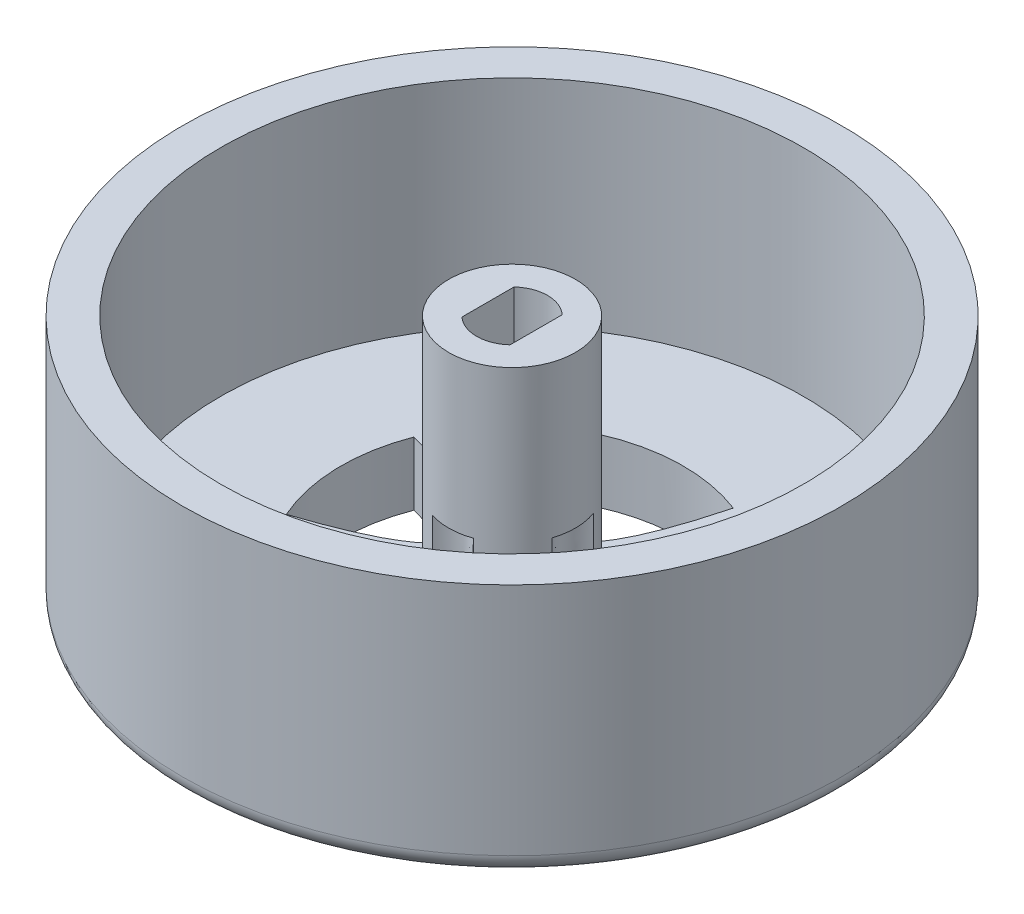
ISO-10303-21;
HEADER;
FILE_DESCRIPTION(('STEP AP214'),'2;1');
FILE_NAME('part.step','',(''),(''),'','','');
FILE_SCHEMA(('AUTOMOTIVE_DESIGN { 1 0 10303 214 1 1 1 1 }'));
ENDSEC;
DATA;
#1=APPLICATION_CONTEXT('core data for automotive mechanical design processes');
#2=APPLICATION_PROTOCOL_DEFINITION('international standard','automotive_design',2000,#1);
#3=PRODUCT_CONTEXT('',#1,'mechanical');
#4=PRODUCT('Part','Part','',(#3));
#5=PRODUCT_RELATED_PRODUCT_CATEGORY('part','',(#4));
#6=PRODUCT_DEFINITION_FORMATION('','',#4);
#7=PRODUCT_DEFINITION_CONTEXT('part definition',#1,'design');
#8=PRODUCT_DEFINITION('design','',#6,#7);
#9=PRODUCT_DEFINITION_SHAPE('','',#8);
#10=(LENGTH_UNIT() NAMED_UNIT(*) SI_UNIT(.MILLI.,.METRE.));
#11=(NAMED_UNIT(*) PLANE_ANGLE_UNIT() SI_UNIT($,.RADIAN.));
#12=(NAMED_UNIT(*) SI_UNIT($,.STERADIAN.) SOLID_ANGLE_UNIT());
#13=UNCERTAINTY_MEASURE_WITH_UNIT(LENGTH_MEASURE(1.E-05),#10,'distance_accuracy_value','');
#14=(GEOMETRIC_REPRESENTATION_CONTEXT(3) GLOBAL_UNCERTAINTY_ASSIGNED_CONTEXT((#13)) GLOBAL_UNIT_ASSIGNED_CONTEXT((#10,
#11,#12)) REPRESENTATION_CONTEXT('',''));
#15=CARTESIAN_POINT('',(0.,0.,0.));
#16=DIRECTION('',(0.,0.,1.));
#17=DIRECTION('',(1.,0.,0.));
#18=AXIS2_PLACEMENT_3D('',#15,#16,#17);
#19=CARTESIAN_POINT('',(0.,-2.,0.));
#20=DIRECTION('',(0.,-1.,0.));
#21=DIRECTION('',(0.,0.,-1.));
#22=AXIS2_PLACEMENT_3D('',#19,#20,#21);
#23=CYLINDRICAL_SURFACE('',#22,1.45);
#24=CARTESIAN_POINT('',(0.,13.,0.));
#25=DIRECTION('',(0.,1.,0.));
#26=DIRECTION('',(0.,0.,1.));
#27=AXIS2_PLACEMENT_3D('',#24,#25,#26);
#28=CIRCLE('',#27,1.45);
#29=CARTESIAN_POINT('',(0.,13.,1.45));
#30=VERTEX_POINT('',#29);
#31=EDGE_CURVE('E320',#30,#30,#28,.T.);
#32=ORIENTED_EDGE('',*,*,#31,.T.);
#33=EDGE_LOOP('',(#32));
#34=FACE_BOUND('',#33,.T.);
#35=CARTESIAN_POINT('',(0.,12.1,0.));
#36=DIRECTION('',(0.,-1.,0.));
#37=DIRECTION('',(0.,0.,-1.));
#38=AXIS2_PLACEMENT_3D('',#35,#36,#37);
#39=CIRCLE('',#38,1.45);
#40=CARTESIAN_POINT('',(0.,12.1,-1.45));
#41=VERTEX_POINT('',#40);
#42=EDGE_CURVE('E131',#41,#41,#39,.F.);
#43=ORIENTED_EDGE('',*,*,#42,.F.);
#44=EDGE_LOOP('',(#43));
#45=FACE_BOUND('',#44,.T.);
#46=ADVANCED_FACE('F127',(#34,#45),#23,.F.);
#47=CARTESIAN_POINT('',(0.,20.,0.));
#48=DIRECTION('',(0.,1.,0.));
#49=DIRECTION('',(0.,0.,1.));
#50=AXIS2_PLACEMENT_3D('',#47,#48,#49);
#51=PLANE('',#50);
#52=CARTESIAN_POINT('',(0.,20.,0.));
#53=DIRECTION('',(0.,1.,0.));
#54=DIRECTION('',(0.,0.,1.));
#55=AXIS2_PLACEMENT_3D('',#52,#53,#54);
#56=CIRCLE('',#55,5.);
#57=CARTESIAN_POINT('',(0.,20.,5.));
#58=VERTEX_POINT('',#57);
#59=EDGE_CURVE('E381',#58,#58,#56,.T.);
#60=ORIENTED_EDGE('',*,*,#59,.T.);
#61=EDGE_LOOP('',(#60));
#62=FACE_BOUND('',#61,.T.);
#63=CARTESIAN_POINT('',(0.,20.,0.));
#64=DIRECTION('',(0.,1.,0.));
#65=DIRECTION('',(0.,0.,1.));
#66=AXIS2_PLACEMENT_3D('',#63,#64,#65);
#67=CIRCLE('',#66,2.8);
#68=CARTESIAN_POINT('',(1.9,20.,-2.05669638012031));
#69=VERTEX_POINT('',#68);
#70=CARTESIAN_POINT('',(-1.9,20.,-2.05669638012031));
#71=VERTEX_POINT('',#70);
#72=EDGE_CURVE('E438',#69,#71,#67,.T.);
#73=ORIENTED_EDGE('',*,*,#72,.F.);
#74=DIRECTION('',(0.,0.,1.));
#75=VECTOR('',#74,1.);
#76=CARTESIAN_POINT('',(1.9,20.,0.));
#77=LINE('',#76,#75);
#78=CARTESIAN_POINT('',(1.9,20.,2.05669638012031));
#79=VERTEX_POINT('',#78);
#80=EDGE_CURVE('E324',#69,#79,#77,.T.);
#81=ORIENTED_EDGE('',*,*,#80,.T.);
#82=CARTESIAN_POINT('',(-1.9,20.,2.05669638012031));
#83=VERTEX_POINT('',#82);
#84=EDGE_CURVE('E436',#83,#79,#67,.T.);
#85=ORIENTED_EDGE('',*,*,#84,.F.);
#86=DIRECTION('',(0.,0.,1.));
#87=VECTOR('',#86,1.);
#88=CARTESIAN_POINT('',(-1.9,20.,0.));
#89=LINE('',#88,#87);
#90=EDGE_CURVE('E408',#71,#83,#89,.T.);
#91=ORIENTED_EDGE('',*,*,#90,.F.);
#92=EDGE_LOOP('',(#73,#81,#85,#91));
#93=FACE_BOUND('',#92,.T.);
#94=ADVANCED_FACE('F545',(#62,#93),#51,.T.);
#95=CARTESIAN_POINT('',(0.,20.,0.));
#96=DIRECTION('',(0.,-1.,0.));
#97=DIRECTION('',(0.,0.,-1.));
#98=AXIS2_PLACEMENT_3D('',#95,#96,#97);
#99=CYLINDRICAL_SURFACE('',#98,26.);
#100=CARTESIAN_POINT('',(0.,1.5,0.));
#101=DIRECTION('',(0.,1.,0.));
#102=DIRECTION('',(0.,0.,1.));
#103=AXIS2_PLACEMENT_3D('',#100,#101,#102);
#104=CIRCLE('',#103,26.);
#105=CARTESIAN_POINT('',(0.,1.5,26.));
#106=VERTEX_POINT('',#105);
#107=EDGE_CURVE('E601',#106,#106,#104,.T.);
#108=ORIENTED_EDGE('',*,*,#107,.T.);
#109=EDGE_LOOP('',(#108));
#110=FACE_BOUND('',#109,.T.);
#111=CARTESIAN_POINT('',(0.,20.,0.));
#112=DIRECTION('',(0.,1.,0.));
#113=DIRECTION('',(0.,0.,1.));
#114=AXIS2_PLACEMENT_3D('',#111,#112,#113);
#115=CIRCLE('',#114,26.);
#116=CARTESIAN_POINT('',(0.,20.,26.));
#117=VERTEX_POINT('',#116);
#118=EDGE_CURVE('E603',#117,#117,#115,.T.);
#119=ORIENTED_EDGE('',*,*,#118,.F.);
#120=EDGE_LOOP('',(#119));
#121=FACE_BOUND('',#120,.T.);
#122=ADVANCED_FACE('F566',(#110,#121),#99,.T.);
#123=CARTESIAN_POINT('',(0.,20.,0.));
#124=DIRECTION('',(0.,1.,0.));
#125=DIRECTION('',(0.,0.,1.));
#126=AXIS2_PLACEMENT_3D('',#123,#124,#125);
#127=PLANE('',#126);
#128=CARTESIAN_POINT('',(0.,20.,0.));
#129=DIRECTION('',(0.,1.,0.));
#130=DIRECTION('',(0.,0.,1.));
#131=AXIS2_PLACEMENT_3D('',#128,#129,#130);
#132=CIRCLE('',#131,23.);
#133=CARTESIAN_POINT('',(0.,20.,23.));
#134=VERTEX_POINT('',#133);
#135=EDGE_CURVE('E608',#134,#134,#132,.T.);
#136=ORIENTED_EDGE('',*,*,#135,.F.);
#137=EDGE_LOOP('',(#136));
#138=FACE_BOUND('',#137,.T.);
#139=ORIENTED_EDGE('',*,*,#118,.T.);
#140=EDGE_LOOP('',(#139));
#141=FACE_BOUND('',#140,.T.);
#142=ADVANCED_FACE('F582',(#138,#141),#127,.T.);
#143=CARTESIAN_POINT('',(0.,0.,0.));
#144=DIRECTION('',(0.,1.,0.));
#145=DIRECTION('',(0.,0.,1.));
#146=AXIS2_PLACEMENT_3D('',#143,#144,#145);
#147=PLANE('',#146);
#148=CARTESIAN_POINT('',(0.,0.,0.));
#149=DIRECTION('',(0.,1.,0.));
#150=DIRECTION('',(0.,0.,1.));
#151=AXIS2_PLACEMENT_3D('',#148,#149,#150);
#152=CIRCLE('',#151,15.);
#153=CARTESIAN_POINT('',(0.,0.,15.));
#154=VERTEX_POINT('',#153);
#155=EDGE_CURVE('E314',#154,#154,#152,.F.);
#156=ORIENTED_EDGE('',*,*,#155,.F.);
#157=EDGE_LOOP('',(#156));
#158=FACE_BOUND('',#157,.T.);
#159=CARTESIAN_POINT('',(0.,0.,0.));
#160=DIRECTION('',(0.,1.,0.));
#161=DIRECTION('',(0.,0.,1.));
#162=AXIS2_PLACEMENT_3D('',#159,#160,#161);
#163=CIRCLE('',#162,24.5);
#164=CARTESIAN_POINT('',(0.,0.,24.5));
#165=VERTEX_POINT('',#164);
#166=EDGE_CURVE('E598',#165,#165,#163,.F.);
#167=ORIENTED_EDGE('',*,*,#166,.T.);
#168=EDGE_LOOP('',(#167));
#169=FACE_BOUND('',#168,.T.);
#170=ADVANCED_FACE('F578',(#158,#169),#147,.F.);
#171=CARTESIAN_POINT('',(0.,20.,0.));
#172=DIRECTION('',(0.,-1.,0.));
#173=DIRECTION('',(0.,0.,-1.));
#174=AXIS2_PLACEMENT_3D('',#171,#172,#173);
#175=CYLINDRICAL_SURFACE('',#174,23.);
#176=ORIENTED_EDGE('',*,*,#135,.T.);
#177=EDGE_LOOP('',(#176));
#178=FACE_BOUND('',#177,.T.);
#179=CARTESIAN_POINT('',(0.,3.,0.));
#180=DIRECTION('',(0.,1.,0.));
#181=DIRECTION('',(0.,0.,1.));
#182=AXIS2_PLACEMENT_3D('',#179,#180,#181);
#183=CIRCLE('',#182,23.);
#184=CARTESIAN_POINT('',(0.,3.,23.));
#185=VERTEX_POINT('',#184);
#186=EDGE_CURVE('E388',#185,#185,#183,.T.);
#187=ORIENTED_EDGE('',*,*,#186,.F.);
#188=EDGE_LOOP('',(#187));
#189=FACE_BOUND('',#188,.T.);
#190=ADVANCED_FACE('F575',(#178,#189),#175,.F.);
#191=CARTESIAN_POINT('',(0.,3.,0.));
#192=DIRECTION('',(0.,1.,0.));
#193=DIRECTION('',(0.,0.,1.));
#194=AXIS2_PLACEMENT_3D('',#191,#192,#193);
#195=PLANE('',#194);
#196=CARTESIAN_POINT('',(-4.9054196009269,3.,14.175219876208));
#197=CARTESIAN_POINT('',(-0.327629175220132,3.,-6.42951360975857));
#198=CARTESIAN_POINT('',(5.64469740939526,3.,13.8973879256631));
#199=B_SPLINE_CURVE_WITH_KNOTS('',2,(#196,#197,#198),.UNSPECIFIED.,.F.,.F.,(3,3),(0.,1.),.UNSPECIFIED.);
#200=CARTESIAN_POINT('',(5.20664395050672,3.,12.4555553377861));
#201=VERTEX_POINT('',#200);
#202=CARTESIAN_POINT('',(1.66412698153181,3.,4.71494235270568));
#203=VERTEX_POINT('',#202);
#204=EDGE_CURVE('E379',#201,#203,#199,.F.);
#205=ORIENTED_EDGE('',*,*,#204,.F.);
#206=CARTESIAN_POINT('',(0.,3.,0.));
#207=DIRECTION('',(0.,1.,0.));
#208=DIRECTION('',(0.,0.,1.));
#209=AXIS2_PLACEMENT_3D('',#206,#207,#208);
#210=CIRCLE('',#209,13.5);
#211=CARTESIAN_POINT('',(-4.56438310784028,3.,12.7049756727379));
#212=VERTEX_POINT('',#211);
#213=EDGE_CURVE('E447',#212,#201,#210,.T.);
#214=ORIENTED_EDGE('',*,*,#213,.F.);
#215=CARTESIAN_POINT('',(-1.52633935125899,3.,4.76133260598315));
#216=VERTEX_POINT('',#215);
#217=EDGE_CURVE('E459',#216,#212,#199,.F.);
#218=ORIENTED_EDGE('',*,*,#217,.F.);
#219=CARTESIAN_POINT('',(0.,3.,0.));
#220=DIRECTION('',(0.,1.,0.));
#221=DIRECTION('',(0.,0.,1.));
#222=AXIS2_PLACEMENT_3D('',#219,#220,#221);
#223=CIRCLE('',#222,5.);
#224=CARTESIAN_POINT('',(-4.6879127894849,3.,1.73881387105805));
#225=VERTEX_POINT('',#224);
#226=EDGE_CURVE('E384',#225,#216,#223,.T.);
#227=ORIENTED_EDGE('',*,*,#226,.F.);
#228=CARTESIAN_POINT('',(-17.0102638514497,3.,-5.8865035211121));
#229=CARTESIAN_POINT('',(9.23658545897457,3.,-0.405402394923291));
#230=CARTESIAN_POINT('',(-16.6768655107957,3.,6.77363689127448));
#231=B_SPLINE_CURVE_WITH_KNOTS('',2,(#228,#229,#230),.UNSPECIFIED.,.F.,.F.,(3,3),(0.,1.),.UNSPECIFIED.);
#232=CARTESIAN_POINT('',(-12.3443419332344,3.,5.46509123760895));
#233=VERTEX_POINT('',#232);
#234=EDGE_CURVE('E465',#233,#225,#231,.F.);
#235=ORIENTED_EDGE('',*,*,#234,.F.);
#236=CARTESIAN_POINT('',(0.,3.,0.));
#237=DIRECTION('',(0.,1.,0.));
#238=DIRECTION('',(0.,0.,1.));
#239=AXIS2_PLACEMENT_3D('',#236,#237,#238);
#240=CIRCLE('',#239,13.5);
#241=CARTESIAN_POINT('',(-12.5961227796564,3.,-4.85671606333139));
#242=VERTEX_POINT('',#241);
#243=EDGE_CURVE('E450',#242,#233,#240,.T.);
#244=ORIENTED_EDGE('',*,*,#243,.F.);
#245=CARTESIAN_POINT('',(-4.73559639331296,3.,-1.60440855134884));
#246=VERTEX_POINT('',#245);
#247=EDGE_CURVE('E464',#246,#242,#231,.F.);
#248=ORIENTED_EDGE('',*,*,#247,.F.);
#249=CARTESIAN_POINT('',(-1.73881387105803,3.,-4.68791278948491));
#250=VERTEX_POINT('',#249);
#251=EDGE_CURVE('E391',#250,#246,#223,.T.);
#252=ORIENTED_EDGE('',*,*,#251,.F.);
#253=CARTESIAN_POINT('',(5.88650352111216,3.,-17.0102638514496));
#254=CARTESIAN_POINT('',(0.40540239492326,3.,9.23658545897457));
#255=CARTESIAN_POINT('',(-6.77363689127442,3.,-16.6768655107957));
#256=B_SPLINE_CURVE_WITH_KNOTS('',2,(#253,#254,#255),.UNSPECIFIED.,.F.,.F.,(3,3),(0.,1.),.UNSPECIFIED.);
#257=CARTESIAN_POINT('',(-5.46509123760891,3.,-12.3443419332344));
#258=VERTEX_POINT('',#257);
#259=EDGE_CURVE('E482',#258,#250,#256,.F.);
#260=ORIENTED_EDGE('',*,*,#259,.F.);
#261=CARTESIAN_POINT('',(0.,3.,0.));
#262=DIRECTION('',(0.,1.,0.));
#263=DIRECTION('',(0.,0.,1.));
#264=AXIS2_PLACEMENT_3D('',#261,#262,#263);
#265=CIRCLE('',#264,13.5);
#266=CARTESIAN_POINT('',(4.85671606333144,3.,-12.5961227796564));
#267=VERTEX_POINT('',#266);
#268=EDGE_CURVE('E456',#267,#258,#265,.T.);
#269=ORIENTED_EDGE('',*,*,#268,.F.);
#270=CARTESIAN_POINT('',(1.60440855134886,3.,-4.73559639331295));
#271=VERTEX_POINT('',#270);
#272=EDGE_CURVE('E481',#271,#267,#256,.F.);
#273=ORIENTED_EDGE('',*,*,#272,.F.);
#274=CARTESIAN_POINT('',(4.68791278948491,3.,-1.73881387105802));
#275=VERTEX_POINT('',#274);
#276=EDGE_CURVE('E382',#275,#271,#223,.T.);
#277=ORIENTED_EDGE('',*,*,#276,.F.);
#278=CARTESIAN_POINT('',(17.0102638514496,3.,5.88650352111222));
#279=CARTESIAN_POINT('',(-9.23658545897457,3.,0.405402394923227));
#280=CARTESIAN_POINT('',(16.6768655107957,3.,-6.77363689127437));
#281=B_SPLINE_CURVE_WITH_KNOTS('',2,(#278,#279,#280),.UNSPECIFIED.,.F.,.F.,(3,3),(0.,1.),.UNSPECIFIED.);
#282=CARTESIAN_POINT('',(12.3443419332345,3.,-5.46509123760887));
#283=VERTEX_POINT('',#282);
#284=EDGE_CURVE('E473',#283,#275,#281,.F.);
#285=ORIENTED_EDGE('',*,*,#284,.F.);
#286=CARTESIAN_POINT('',(0.,3.,0.));
#287=DIRECTION('',(0.,1.,0.));
#288=DIRECTION('',(0.,0.,1.));
#289=AXIS2_PLACEMENT_3D('',#286,#287,#288);
#290=CIRCLE('',#289,13.5);
#291=CARTESIAN_POINT('',(12.5961227796564,3.,4.85671606333148));
#292=VERTEX_POINT('',#291);
#293=EDGE_CURVE('E453',#292,#283,#290,.T.);
#294=ORIENTED_EDGE('',*,*,#293,.F.);
#295=CARTESIAN_POINT('',(4.73559639331295,3.,1.60440855134887));
#296=VERTEX_POINT('',#295);
#297=EDGE_CURVE('E275',#296,#292,#281,.F.);
#298=ORIENTED_EDGE('',*,*,#297,.F.);
#299=EDGE_CURVE('E371',#203,#296,#223,.T.);
#300=ORIENTED_EDGE('',*,*,#299,.F.);
#301=EDGE_LOOP('',(#205,#214,#218,#227,#235,#244,#248,#252,#260,#269,#273,#277,#285,#294,#298,#300));
#302=FACE_BOUND('',#301,.T.);
#303=ORIENTED_EDGE('',*,*,#186,.T.);
#304=EDGE_LOOP('',(#303));
#305=FACE_BOUND('',#304,.T.);
#306=ADVANCED_FACE('F376',(#302,#305),#195,.T.);
#307=CARTESIAN_POINT('',(0.,1.5,0.));
#308=DIRECTION('',(0.,1.,0.));
#309=DIRECTION('',(0.,0.,1.));
#310=AXIS2_PLACEMENT_3D('',#307,#308,#309);
#311=TOROIDAL_SURFACE('',#310,24.5,1.5);
#312=ORIENTED_EDGE('',*,*,#166,.F.);
#313=EDGE_LOOP('',(#312));
#314=FACE_BOUND('',#313,.T.);
#315=ORIENTED_EDGE('',*,*,#107,.F.);
#316=EDGE_LOOP('',(#315));
#317=FACE_BOUND('',#316,.T.);
#318=ADVANCED_FACE('F573',(#314,#317),#311,.T.);
#319=CARTESIAN_POINT('',(0.,-2.,0.));
#320=DIRECTION('',(0.,1.,0.));
#321=DIRECTION('',(0.,0.,1.));
#322=AXIS2_PLACEMENT_3D('',#319,#320,#321);
#323=CYLINDRICAL_SURFACE('',#322,15.);
#324=CARTESIAN_POINT('',(0.,-0.5,0.));
#325=DIRECTION('',(0.,-1.,0.));
#326=DIRECTION('',(0.,0.,-1.));
#327=AXIS2_PLACEMENT_3D('',#324,#325,#326);
#328=CIRCLE('',#327,15.);
#329=CARTESIAN_POINT('',(0.,-0.5,-15.));
#330=VERTEX_POINT('',#329);
#331=EDGE_CURVE('E309',#330,#330,#328,.F.);
#332=ORIENTED_EDGE('',*,*,#331,.T.);
#333=EDGE_LOOP('',(#332));
#334=FACE_BOUND('',#333,.T.);
#335=ORIENTED_EDGE('',*,*,#155,.T.);
#336=EDGE_LOOP('',(#335));
#337=FACE_BOUND('',#336,.T.);
#338=ADVANCED_FACE('F570',(#334,#337),#323,.T.);
#339=CARTESIAN_POINT('',(0.,-2.,0.));
#340=DIRECTION('',(0.,-1.,0.));
#341=DIRECTION('',(0.,0.,-1.));
#342=AXIS2_PLACEMENT_3D('',#339,#340,#341);
#343=PLANE('',#342);
#344=CARTESIAN_POINT('',(-4.9054196009269,-2.,14.175219876208));
#345=CARTESIAN_POINT('',(-0.327629175220132,-2.,-6.42951360975857));
#346=CARTESIAN_POINT('',(5.64469740939526,-2.,13.8973879256631));
#347=B_SPLINE_CURVE_WITH_KNOTS('',2,(#344,#345,#346),.UNSPECIFIED.,.F.,.F.,(3,3),(0.,1.),.UNSPECIFIED.);
#348=CARTESIAN_POINT('',(-4.56438310784028,-2.,12.7049756727379));
#349=VERTEX_POINT('',#348);
#350=CARTESIAN_POINT('',(5.20664395050672,-2.,12.4555553377861));
#351=VERTEX_POINT('',#350);
#352=EDGE_CURVE('E671',#349,#351,#347,.T.);
#353=ORIENTED_EDGE('',*,*,#352,.F.);
#354=CARTESIAN_POINT('',(0.,-2.,0.));
#355=DIRECTION('',(0.,-1.,0.));
#356=DIRECTION('',(0.,0.,-1.));
#357=AXIS2_PLACEMENT_3D('',#354,#355,#356);
#358=CIRCLE('',#357,13.5);
#359=CARTESIAN_POINT('',(-12.3443419332344,-2.,5.46509123760895));
#360=VERTEX_POINT('',#359);
#361=EDGE_CURVE('E305',#349,#360,#358,.T.);
#362=ORIENTED_EDGE('',*,*,#361,.T.);
#363=CARTESIAN_POINT('',(-17.0102638514497,-2.,-5.8865035211121));
#364=CARTESIAN_POINT('',(9.23658545897457,-2.,-0.405402394923291));
#365=CARTESIAN_POINT('',(-16.6768655107957,-2.,6.77363689127448));
#366=B_SPLINE_CURVE_WITH_KNOTS('',2,(#363,#364,#365),.UNSPECIFIED.,.F.,.F.,(3,3),(0.,1.),.UNSPECIFIED.);
#367=CARTESIAN_POINT('',(-12.5961227796564,-2.,-4.85671606333139));
#368=VERTEX_POINT('',#367);
#369=EDGE_CURVE('E152',#368,#360,#366,.T.);
#370=ORIENTED_EDGE('',*,*,#369,.F.);
#371=CARTESIAN_POINT('',(-5.46509123760891,-2.,-12.3443419332344));
#372=VERTEX_POINT('',#371);
#373=EDGE_CURVE('E310',#368,#372,#358,.T.);
#374=ORIENTED_EDGE('',*,*,#373,.T.);
#375=CARTESIAN_POINT('',(5.88650352111216,-2.,-17.0102638514496));
#376=CARTESIAN_POINT('',(0.40540239492326,-2.,9.23658545897457));
#377=CARTESIAN_POINT('',(-6.77363689127442,-2.,-16.6768655107957));
#378=B_SPLINE_CURVE_WITH_KNOTS('',2,(#375,#376,#377),.UNSPECIFIED.,.F.,.F.,(3,3),(0.,1.),.UNSPECIFIED.);
#379=CARTESIAN_POINT('',(4.85671606333144,-2.,-12.5961227796564));
#380=VERTEX_POINT('',#379);
#381=EDGE_CURVE('E144',#380,#372,#378,.T.);
#382=ORIENTED_EDGE('',*,*,#381,.F.);
#383=CARTESIAN_POINT('',(12.3443419332345,-2.,-5.46509123760887));
#384=VERTEX_POINT('',#383);
#385=EDGE_CURVE('E297',#380,#384,#358,.T.);
#386=ORIENTED_EDGE('',*,*,#385,.T.);
#387=CARTESIAN_POINT('',(17.0102638514496,-2.,5.88650352111222));
#388=CARTESIAN_POINT('',(-9.23658545897457,-2.,0.405402394923227));
#389=CARTESIAN_POINT('',(16.6768655107957,-2.,-6.77363689127437));
#390=B_SPLINE_CURVE_WITH_KNOTS('',2,(#387,#388,#389),.UNSPECIFIED.,.F.,.F.,(3,3),(0.,1.),.UNSPECIFIED.);
#391=CARTESIAN_POINT('',(12.5961227796564,-2.,4.85671606333148));
#392=VERTEX_POINT('',#391);
#393=EDGE_CURVE('E272',#392,#384,#390,.T.);
#394=ORIENTED_EDGE('',*,*,#393,.F.);
#395=EDGE_CURVE('E296',#392,#351,#358,.T.);
#396=ORIENTED_EDGE('',*,*,#395,.T.);
#397=EDGE_LOOP('',(#353,#362,#370,#374,#382,#386,#394,#396));
#398=FACE_BOUND('',#397,.T.);
#399=CARTESIAN_POINT('',(0.,-2.,0.));
#400=DIRECTION('',(0.,-1.,0.));
#401=DIRECTION('',(0.,0.,-1.));
#402=AXIS2_PLACEMENT_3D('',#399,#400,#401);
#403=CIRCLE('',#402,3.);
#404=CARTESIAN_POINT('',(0.,-2.,-3.));
#405=VERTEX_POINT('',#404);
#406=EDGE_CURVE('E443',#405,#405,#403,.T.);
#407=ORIENTED_EDGE('',*,*,#406,.F.);
#408=EDGE_LOOP('',(#407));
#409=FACE_BOUND('',#408,.T.);
#410=ADVANCED_FACE('F294',(#398,#409),#343,.T.);
#411=CARTESIAN_POINT('',(0.,-0.5,0.));
#412=DIRECTION('',(0.,-1.,0.));
#413=DIRECTION('',(0.,0.,-1.));
#414=AXIS2_PLACEMENT_3D('',#411,#412,#413);
#415=TOROIDAL_SURFACE('',#414,13.5,1.5);
#416=ORIENTED_EDGE('',*,*,#331,.F.);
#417=EDGE_LOOP('',(#416));
#418=FACE_BOUND('',#417,.T.);
#419=ORIENTED_EDGE('',*,*,#385,.F.);
#420=CARTESIAN_POINT('',(0.,-2.,0.));
#421=DIRECTION('',(0.,-1.,0.));
#422=DIRECTION('',(0.,0.,-1.));
#423=AXIS2_PLACEMENT_3D('',#420,#421,#422);
#424=CIRCLE('',#423,13.5);
#425=EDGE_CURVE('E504',#372,#380,#424,.T.);
#426=ORIENTED_EDGE('',*,*,#425,.F.);
#427=ORIENTED_EDGE('',*,*,#373,.F.);
#428=CARTESIAN_POINT('',(0.,-2.,0.));
#429=DIRECTION('',(0.,-1.,0.));
#430=DIRECTION('',(0.,0.,-1.));
#431=AXIS2_PLACEMENT_3D('',#428,#429,#430);
#432=CIRCLE('',#431,13.5);
#433=EDGE_CURVE('E633',#360,#368,#432,.T.);
#434=ORIENTED_EDGE('',*,*,#433,.F.);
#435=ORIENTED_EDGE('',*,*,#361,.F.);
#436=CARTESIAN_POINT('',(0.,-2.,0.));
#437=DIRECTION('',(0.,-1.,0.));
#438=DIRECTION('',(0.,0.,-1.));
#439=AXIS2_PLACEMENT_3D('',#436,#437,#438);
#440=CIRCLE('',#439,13.5);
#441=EDGE_CURVE('E303',#351,#349,#440,.T.);
#442=ORIENTED_EDGE('',*,*,#441,.F.);
#443=ORIENTED_EDGE('',*,*,#395,.F.);
#444=CARTESIAN_POINT('',(0.,-2.,0.));
#445=DIRECTION('',(0.,-1.,0.));
#446=DIRECTION('',(0.,0.,-1.));
#447=AXIS2_PLACEMENT_3D('',#444,#445,#446);
#448=CIRCLE('',#447,13.5);
#449=EDGE_CURVE('E283',#384,#392,#448,.T.);
#450=ORIENTED_EDGE('',*,*,#449,.F.);
#451=EDGE_LOOP('',(#419,#426,#427,#434,#435,#442,#443,#450));
#452=FACE_BOUND('',#451,.T.);
#453=ADVANCED_FACE('F129',(#418,#452),#415,.T.);
#454=CARTESIAN_POINT('',(0.,34.142135623731,0.));
#455=DIRECTION('',(0.,-1.,0.));
#456=DIRECTION('',(0.,0.,-1.));
#457=AXIS2_PLACEMENT_3D('',#454,#455,#456);
#458=CYLINDRICAL_SURFACE('',#457,5.);
#459=ORIENTED_EDGE('',*,*,#226,.T.);
#460=DIRECTION('',(0.,-1.,0.));
#461=VECTOR('',#460,1.);
#462=CARTESIAN_POINT('',(-1.52633935125899,8.,4.76133260598315));
#463=LINE('',#462,#461);
#464=CARTESIAN_POINT('',(-1.52633935125899,8.,4.76133260598315));
#465=VERTEX_POINT('',#464);
#466=EDGE_CURVE('E12',#216,#465,#463,.F.);
#467=ORIENTED_EDGE('',*,*,#466,.T.);
#468=CARTESIAN_POINT('',(0.,8.,0.));
#469=DIRECTION('',(0.,-1.,0.));
#470=DIRECTION('',(0.,0.,-1.));
#471=AXIS2_PLACEMENT_3D('',#468,#469,#470);
#472=CIRCLE('',#471,5.);
#473=CARTESIAN_POINT('',(1.66412698153181,8.,4.71494235270569));
#474=VERTEX_POINT('',#473);
#475=EDGE_CURVE('E358',#474,#465,#472,.T.);
#476=ORIENTED_EDGE('',*,*,#475,.F.);
#477=DIRECTION('',(0.,-1.,0.));
#478=VECTOR('',#477,1.);
#479=CARTESIAN_POINT('',(1.66412698153181,8.,4.71494235270569));
#480=LINE('',#479,#478);
#481=EDGE_CURVE('E137',#474,#203,#480,.T.);
#482=ORIENTED_EDGE('',*,*,#481,.T.);
#483=ORIENTED_EDGE('',*,*,#299,.T.);
#484=DIRECTION('',(0.,-1.,0.));
#485=VECTOR('',#484,1.);
#486=CARTESIAN_POINT('',(4.73559639331295,8.,1.60440855134887));
#487=LINE('',#486,#485);
#488=CARTESIAN_POINT('',(4.73559639331295,8.,1.60440855134887));
#489=VERTEX_POINT('',#488);
#490=EDGE_CURVE('E343',#296,#489,#487,.F.);
#491=ORIENTED_EDGE('',*,*,#490,.T.);
#492=CARTESIAN_POINT('',(0.,8.,0.));
#493=DIRECTION('',(0.,-1.,0.));
#494=DIRECTION('',(0.,0.,-1.));
#495=AXIS2_PLACEMENT_3D('',#492,#493,#494);
#496=CIRCLE('',#495,5.);
#497=CARTESIAN_POINT('',(4.68791278948492,8.,-1.73881387105801));
#498=VERTEX_POINT('',#497);
#499=EDGE_CURVE('E336',#498,#489,#496,.T.);
#500=ORIENTED_EDGE('',*,*,#499,.F.);
#501=DIRECTION('',(0.,-1.,0.));
#502=VECTOR('',#501,1.);
#503=CARTESIAN_POINT('',(4.68791278948491,8.,-1.73881387105802));
#504=LINE('',#503,#502);
#505=EDGE_CURVE('E339',#498,#275,#504,.T.);
#506=ORIENTED_EDGE('',*,*,#505,.T.);
#507=ORIENTED_EDGE('',*,*,#276,.T.);
#508=DIRECTION('',(0.,-1.,0.));
#509=VECTOR('',#508,1.);
#510=CARTESIAN_POINT('',(1.60440855134886,8.,-4.73559639331295));
#511=LINE('',#510,#509);
#512=CARTESIAN_POINT('',(1.60440855134886,8.,-4.73559639331295));
#513=VERTEX_POINT('',#512);
#514=EDGE_CURVE('E332',#271,#513,#511,.F.);
#515=ORIENTED_EDGE('',*,*,#514,.T.);
#516=CARTESIAN_POINT('',(0.,8.,0.));
#517=DIRECTION('',(0.,-1.,0.));
#518=DIRECTION('',(0.,0.,-1.));
#519=AXIS2_PLACEMENT_3D('',#516,#517,#518);
#520=CIRCLE('',#519,5.);
#521=CARTESIAN_POINT('',(-1.73881387105803,8.,-4.68791278948491));
#522=VERTEX_POINT('',#521);
#523=EDGE_CURVE('E319',#522,#513,#520,.T.);
#524=ORIENTED_EDGE('',*,*,#523,.F.);
#525=DIRECTION('',(0.,-1.,0.));
#526=VECTOR('',#525,1.);
#527=CARTESIAN_POINT('',(-1.73881387105803,8.,-4.68791278948491));
#528=LINE('',#527,#526);
#529=EDGE_CURVE('E328',#522,#250,#528,.T.);
#530=ORIENTED_EDGE('',*,*,#529,.T.);
#531=ORIENTED_EDGE('',*,*,#251,.T.);
#532=DIRECTION('',(0.,-1.,0.));
#533=VECTOR('',#532,1.);
#534=CARTESIAN_POINT('',(-4.73559639331296,8.,-1.60440855134884));
#535=LINE('',#534,#533);
#536=CARTESIAN_POINT('',(-4.73559639331296,8.,-1.60440855134884));
#537=VERTEX_POINT('',#536);
#538=EDGE_CURVE('E354',#246,#537,#535,.F.);
#539=ORIENTED_EDGE('',*,*,#538,.T.);
#540=CARTESIAN_POINT('',(0.,8.,0.));
#541=DIRECTION('',(0.,-1.,0.));
#542=DIRECTION('',(0.,0.,-1.));
#543=AXIS2_PLACEMENT_3D('',#540,#541,#542);
#544=CIRCLE('',#543,5.);
#545=CARTESIAN_POINT('',(-4.6879127894849,8.,1.73881387105805));
#546=VERTEX_POINT('',#545);
#547=EDGE_CURVE('E347',#546,#537,#544,.T.);
#548=ORIENTED_EDGE('',*,*,#547,.F.);
#549=DIRECTION('',(0.,-1.,0.));
#550=VECTOR('',#549,1.);
#551=CARTESIAN_POINT('',(-4.6879127894849,8.,1.73881387105805));
#552=LINE('',#551,#550);
#553=EDGE_CURVE('E350',#546,#225,#552,.T.);
#554=ORIENTED_EDGE('',*,*,#553,.T.);
#555=EDGE_LOOP('',(#459,#467,#476,#482,#483,#491,#500,#506,#507,#515,#524,#530,#531,#539,#548,#554));
#556=FACE_BOUND('',#555,.T.);
#557=ORIENTED_EDGE('',*,*,#59,.F.);
#558=EDGE_LOOP('',(#557));
#559=FACE_BOUND('',#558,.T.);
#560=ADVANCED_FACE('F369',(#556,#559),#458,.T.);
#561=CARTESIAN_POINT('',(1.9,13.,0.));
#562=DIRECTION('',(-1.,0.,0.));
#563=DIRECTION('',(0.,0.,1.));
#564=AXIS2_PLACEMENT_3D('',#561,#562,#563);
#565=PLANE('',#564);
#566=ORIENTED_EDGE('',*,*,#80,.F.);
#567=DIRECTION('',(0.,1.,0.));
#568=VECTOR('',#567,1.);
#569=CARTESIAN_POINT('',(1.9,13.,-2.05669638012031));
#570=LINE('',#569,#568);
#571=CARTESIAN_POINT('',(1.9,13.,-2.05669638012031));
#572=VERTEX_POINT('',#571);
#573=EDGE_CURVE('E412',#572,#69,#570,.T.);
#574=ORIENTED_EDGE('',*,*,#573,.F.);
#575=DIRECTION('',(0.,0.,1.));
#576=VECTOR('',#575,1.);
#577=CARTESIAN_POINT('',(1.9,13.,0.));
#578=LINE('',#577,#576);
#579=CARTESIAN_POINT('',(1.9,13.,2.05669638012031));
#580=VERTEX_POINT('',#579);
#581=EDGE_CURVE('E434',#572,#580,#578,.T.);
#582=ORIENTED_EDGE('',*,*,#581,.T.);
#583=DIRECTION('',(0.,1.,0.));
#584=VECTOR('',#583,1.);
#585=CARTESIAN_POINT('',(1.9,13.,2.05669638012031));
#586=LINE('',#585,#584);
#587=EDGE_CURVE('E394',#580,#79,#586,.T.);
#588=ORIENTED_EDGE('',*,*,#587,.T.);
#589=EDGE_LOOP('',(#566,#574,#582,#588));
#590=FACE_BOUND('',#589,.T.);
#591=ADVANCED_FACE('F555',(#590),#565,.T.);
#592=CARTESIAN_POINT('',(0.,13.,0.));
#593=DIRECTION('',(0.,1.,0.));
#594=DIRECTION('',(0.,0.,1.));
#595=AXIS2_PLACEMENT_3D('',#592,#593,#594);
#596=CYLINDRICAL_SURFACE('',#595,2.8);
#597=ORIENTED_EDGE('',*,*,#84,.T.);
#598=ORIENTED_EDGE('',*,*,#587,.F.);
#599=CARTESIAN_POINT('',(0.,13.,0.));
#600=DIRECTION('',(0.,1.,0.));
#601=DIRECTION('',(0.,0.,1.));
#602=AXIS2_PLACEMENT_3D('',#599,#600,#601);
#603=CIRCLE('',#602,2.8);
#604=CARTESIAN_POINT('',(-1.9,13.,2.05669638012031));
#605=VERTEX_POINT('',#604);
#606=EDGE_CURVE('E415',#605,#580,#603,.T.);
#607=ORIENTED_EDGE('',*,*,#606,.F.);
#608=DIRECTION('',(0.,1.,0.));
#609=VECTOR('',#608,1.);
#610=CARTESIAN_POINT('',(-1.9,13.,2.05669638012031));
#611=LINE('',#610,#609);
#612=EDGE_CURVE('E399',#605,#83,#611,.T.);
#613=ORIENTED_EDGE('',*,*,#612,.T.);
#614=EDGE_LOOP('',(#597,#598,#607,#613));
#615=FACE_BOUND('',#614,.T.);
#616=ADVANCED_FACE('F551',(#615),#596,.F.);
#617=CARTESIAN_POINT('',(-1.9,13.,0.));
#618=DIRECTION('',(-1.,0.,0.));
#619=DIRECTION('',(0.,0.,1.));
#620=AXIS2_PLACEMENT_3D('',#617,#618,#619);
#621=PLANE('',#620);
#622=ORIENTED_EDGE('',*,*,#90,.T.);
#623=ORIENTED_EDGE('',*,*,#612,.F.);
#624=DIRECTION('',(0.,0.,1.));
#625=VECTOR('',#624,1.);
#626=CARTESIAN_POINT('',(-1.9,13.,0.));
#627=LINE('',#626,#625);
#628=CARTESIAN_POINT('',(-1.9,13.,-2.05669638012031));
#629=VERTEX_POINT('',#628);
#630=EDGE_CURVE('E422',#629,#605,#627,.T.);
#631=ORIENTED_EDGE('',*,*,#630,.F.);
#632=DIRECTION('',(0.,1.,0.));
#633=VECTOR('',#632,1.);
#634=CARTESIAN_POINT('',(-1.9,13.,-2.05669638012031));
#635=LINE('',#634,#633);
#636=EDGE_CURVE('E405',#629,#71,#635,.T.);
#637=ORIENTED_EDGE('',*,*,#636,.T.);
#638=EDGE_LOOP('',(#622,#623,#631,#637));
#639=FACE_BOUND('',#638,.T.);
#640=ADVANCED_FACE('F554',(#639),#621,.F.);
#641=ORIENTED_EDGE('',*,*,#72,.T.);
#642=ORIENTED_EDGE('',*,*,#636,.F.);
#643=EDGE_CURVE('E424',#572,#629,#603,.T.);
#644=ORIENTED_EDGE('',*,*,#643,.F.);
#645=ORIENTED_EDGE('',*,*,#573,.T.);
#646=EDGE_LOOP('',(#641,#642,#644,#645));
#647=FACE_BOUND('',#646,.T.);
#648=ADVANCED_FACE('F549',(#647),#596,.F.);
#649=CARTESIAN_POINT('',(0.,13.,0.));
#650=DIRECTION('',(0.,1.,0.));
#651=DIRECTION('',(0.,0.,1.));
#652=AXIS2_PLACEMENT_3D('',#649,#650,#651);
#653=PLANE('',#652);
#654=ORIENTED_EDGE('',*,*,#31,.F.);
#655=EDGE_LOOP('',(#654));
#656=FACE_BOUND('',#655,.T.);
#657=ORIENTED_EDGE('',*,*,#581,.F.);
#658=ORIENTED_EDGE('',*,*,#643,.T.);
#659=ORIENTED_EDGE('',*,*,#630,.T.);
#660=ORIENTED_EDGE('',*,*,#606,.T.);
#661=EDGE_LOOP('',(#657,#658,#659,#660));
#662=FACE_BOUND('',#661,.T.);
#663=ADVANCED_FACE('F541',(#656,#662),#653,.T.);
#664=CARTESIAN_POINT('',(1.45,0.1,0.));
#665=DIRECTION('',(0.,1.,0.));
#666=DIRECTION('',(0.,0.,1.));
#667=AXIS2_PLACEMENT_3D('',#664,#665,#666);
#668=PLANE('',#667);
#669=CARTESIAN_POINT('',(0.,0.1,0.));
#670=DIRECTION('',(0.,-1.,0.));
#671=DIRECTION('',(0.,0.,-1.));
#672=AXIS2_PLACEMENT_3D('',#669,#670,#671);
#673=CIRCLE('',#672,2.97558566175909);
#674=CARTESIAN_POINT('',(0.,0.1,-2.97558566175909));
#675=VERTEX_POINT('',#674);
#676=EDGE_CURVE('E686',#675,#675,#673,.T.);
#677=ORIENTED_EDGE('',*,*,#676,.F.);
#678=EDGE_LOOP('',(#677));
#679=FACE_BOUND('',#678,.T.);
#680=CARTESIAN_POINT('',(0.,0.1,0.));
#681=DIRECTION('',(0.,-1.,0.));
#682=DIRECTION('',(0.,0.,-1.));
#683=AXIS2_PLACEMENT_3D('',#680,#681,#682);
#684=CIRCLE('',#683,3.);
#685=CARTESIAN_POINT('',(0.,0.1,-3.));
#686=VERTEX_POINT('',#685);
#687=EDGE_CURVE('E325',#686,#686,#684,.T.);
#688=ORIENTED_EDGE('',*,*,#687,.T.);
#689=EDGE_LOOP('',(#688));
#690=FACE_BOUND('',#689,.T.);
#691=ADVANCED_FACE('F537',(#679,#690),#668,.F.);
#692=CARTESIAN_POINT('',(0.,-2.,0.));
#693=DIRECTION('',(0.,-1.,0.));
#694=DIRECTION('',(0.,0.,-1.));
#695=AXIS2_PLACEMENT_3D('',#692,#693,#694);
#696=CYLINDRICAL_SURFACE('',#695,3.);
#697=ORIENTED_EDGE('',*,*,#687,.F.);
#698=EDGE_LOOP('',(#697));
#699=FACE_BOUND('',#698,.T.);
#700=ORIENTED_EDGE('',*,*,#406,.T.);
#701=EDGE_LOOP('',(#700));
#702=FACE_BOUND('',#701,.T.);
#703=ADVANCED_FACE('F534',(#699,#702),#696,.F.);
#704=CARTESIAN_POINT('',(0.,8.,0.));
#705=DIRECTION('',(0.,-1.,0.));
#706=DIRECTION('',(0.,0.,-1.));
#707=AXIS2_PLACEMENT_3D('',#704,#705,#706);
#708=PLANE('',#707);
#709=ORIENTED_EDGE('',*,*,#523,.T.);
#710=CARTESIAN_POINT('',(5.88650352111216,8.,-17.0102638514496));
#711=CARTESIAN_POINT('',(0.40540239492326,8.,9.23658545897457));
#712=CARTESIAN_POINT('',(-6.77363689127442,8.,-16.6768655107957));
#713=B_SPLINE_CURVE_WITH_KNOTS('',2,(#710,#711,#712),.UNSPECIFIED.,.F.,.F.,(3,3),(0.,1.),.UNSPECIFIED.);
#714=EDGE_CURVE('E497',#513,#522,#713,.T.);
#715=ORIENTED_EDGE('',*,*,#714,.T.);
#716=EDGE_LOOP('',(#709,#715));
#717=FACE_BOUND('',#716,.T.);
#718=ADVANCED_FACE('F529',(#717),#708,.T.);
#719=CARTESIAN_POINT('',(0.,8.,0.));
#720=DIRECTION('',(0.,-1.,0.));
#721=DIRECTION('',(0.,0.,-1.));
#722=AXIS2_PLACEMENT_3D('',#719,#720,#721);
#723=CYLINDRICAL_SURFACE('',#722,13.5);
#724=ORIENTED_EDGE('',*,*,#268,.T.);
#725=DIRECTION('',(0.,-1.,0.));
#726=VECTOR('',#725,1.);
#727=CARTESIAN_POINT('',(-5.46509123760891,8.,-12.3443419332344));
#728=LINE('',#727,#726);
#729=EDGE_CURVE('E490',#258,#372,#728,.T.);
#730=ORIENTED_EDGE('',*,*,#729,.T.);
#731=ORIENTED_EDGE('',*,*,#425,.T.);
#732=DIRECTION('',(0.,-1.,0.));
#733=VECTOR('',#732,1.);
#734=CARTESIAN_POINT('',(4.85671606333144,8.,-12.5961227796564));
#735=LINE('',#734,#733);
#736=EDGE_CURVE('E491',#267,#380,#735,.T.);
#737=ORIENTED_EDGE('',*,*,#736,.F.);
#738=EDGE_LOOP('',(#724,#730,#731,#737));
#739=FACE_BOUND('',#738,.T.);
#740=ADVANCED_FACE('F528',(#739),#723,.F.);
#741=DIRECTION('',(0.,-1.,0.));
#742=VECTOR('',#741,1.);
#743=SURFACE_OF_LINEAR_EXTRUSION('',#713,#742);
#744=ORIENTED_EDGE('',*,*,#272,.T.);
#745=ORIENTED_EDGE('',*,*,#736,.T.);
#746=ORIENTED_EDGE('',*,*,#381,.T.);
#747=ORIENTED_EDGE('',*,*,#729,.F.);
#748=ORIENTED_EDGE('',*,*,#259,.T.);
#749=ORIENTED_EDGE('',*,*,#529,.F.);
#750=ORIENTED_EDGE('',*,*,#714,.F.);
#751=ORIENTED_EDGE('',*,*,#514,.F.);
#752=EDGE_LOOP('',(#744,#745,#746,#747,#748,#749,#750,#751));
#753=FACE_BOUND('',#752,.T.);
#754=ADVANCED_FACE('F523',(#753),#743,.F.);
#755=CARTESIAN_POINT('',(0.,8.,0.));
#756=DIRECTION('',(0.,-1.,0.));
#757=DIRECTION('',(0.,0.,-1.));
#758=AXIS2_PLACEMENT_3D('',#755,#756,#757);
#759=PLANE('',#758);
#760=ORIENTED_EDGE('',*,*,#499,.T.);
#761=CARTESIAN_POINT('',(17.0102638514496,8.,5.88650352111222));
#762=CARTESIAN_POINT('',(-9.23658545897457,8.,0.405402394923227));
#763=CARTESIAN_POINT('',(16.6768655107957,8.,-6.77363689127437));
#764=B_SPLINE_CURVE_WITH_KNOTS('',2,(#761,#762,#763),.UNSPECIFIED.,.F.,.F.,(3,3),(0.,1.),.UNSPECIFIED.);
#765=EDGE_CURVE('E280',#489,#498,#764,.T.);
#766=ORIENTED_EDGE('',*,*,#765,.T.);
#767=EDGE_LOOP('',(#760,#766));
#768=FACE_BOUND('',#767,.T.);
#769=ADVANCED_FACE('F527',(#768),#759,.T.);
#770=CARTESIAN_POINT('',(0.,8.,0.));
#771=DIRECTION('',(0.,-1.,0.));
#772=DIRECTION('',(0.,0.,-1.));
#773=AXIS2_PLACEMENT_3D('',#770,#771,#772);
#774=CYLINDRICAL_SURFACE('',#773,13.5);
#775=ORIENTED_EDGE('',*,*,#293,.T.);
#776=DIRECTION('',(0.,-1.,0.));
#777=VECTOR('',#776,1.);
#778=CARTESIAN_POINT('',(12.3443419332345,8.,-5.46509123760887));
#779=LINE('',#778,#777);
#780=EDGE_CURVE('E279',#283,#384,#779,.T.);
#781=ORIENTED_EDGE('',*,*,#780,.T.);
#782=ORIENTED_EDGE('',*,*,#449,.T.);
#783=DIRECTION('',(0.,-1.,0.));
#784=VECTOR('',#783,1.);
#785=CARTESIAN_POINT('',(12.5961227796564,8.,4.85671606333148));
#786=LINE('',#785,#784);
#787=EDGE_CURVE('E267',#292,#392,#786,.T.);
#788=ORIENTED_EDGE('',*,*,#787,.F.);
#789=EDGE_LOOP('',(#775,#781,#782,#788));
#790=FACE_BOUND('',#789,.T.);
#791=ADVANCED_FACE('F284',(#790),#774,.F.);
#792=DIRECTION('',(0.,-1.,0.));
#793=VECTOR('',#792,1.);
#794=SURFACE_OF_LINEAR_EXTRUSION('',#764,#793);
#795=ORIENTED_EDGE('',*,*,#297,.T.);
#796=ORIENTED_EDGE('',*,*,#787,.T.);
#797=ORIENTED_EDGE('',*,*,#393,.T.);
#798=ORIENTED_EDGE('',*,*,#780,.F.);
#799=ORIENTED_EDGE('',*,*,#284,.T.);
#800=ORIENTED_EDGE('',*,*,#505,.F.);
#801=ORIENTED_EDGE('',*,*,#765,.F.);
#802=ORIENTED_EDGE('',*,*,#490,.F.);
#803=EDGE_LOOP('',(#795,#796,#797,#798,#799,#800,#801,#802));
#804=FACE_BOUND('',#803,.T.);
#805=ADVANCED_FACE('F269',(#804),#794,.F.);
#806=CARTESIAN_POINT('',(0.,8.,0.));
#807=DIRECTION('',(0.,-1.,0.));
#808=DIRECTION('',(0.,0.,-1.));
#809=AXIS2_PLACEMENT_3D('',#806,#807,#808);
#810=PLANE('',#809);
#811=ORIENTED_EDGE('',*,*,#547,.T.);
#812=CARTESIAN_POINT('',(-17.0102638514497,8.,-5.8865035211121));
#813=CARTESIAN_POINT('',(9.23658545897457,8.,-0.405402394923291));
#814=CARTESIAN_POINT('',(-16.6768655107957,8.,6.77363689127448));
#815=B_SPLINE_CURVE_WITH_KNOTS('',2,(#812,#813,#814),.UNSPECIFIED.,.F.,.F.,(3,3),(0.,1.),.UNSPECIFIED.);
#816=EDGE_CURVE('E655',#537,#546,#815,.T.);
#817=ORIENTED_EDGE('',*,*,#816,.T.);
#818=EDGE_LOOP('',(#811,#817));
#819=FACE_BOUND('',#818,.T.);
#820=ADVANCED_FACE('F702',(#819),#810,.T.);
#821=CARTESIAN_POINT('',(0.,8.,0.));
#822=DIRECTION('',(0.,-1.,0.));
#823=DIRECTION('',(0.,0.,-1.));
#824=AXIS2_PLACEMENT_3D('',#821,#822,#823);
#825=CYLINDRICAL_SURFACE('',#824,13.5);
#826=ORIENTED_EDGE('',*,*,#243,.T.);
#827=DIRECTION('',(0.,-1.,0.));
#828=VECTOR('',#827,1.);
#829=CARTESIAN_POINT('',(-12.3443419332344,8.,5.46509123760895));
#830=LINE('',#829,#828);
#831=EDGE_CURVE('E511',#233,#360,#830,.T.);
#832=ORIENTED_EDGE('',*,*,#831,.T.);
#833=ORIENTED_EDGE('',*,*,#433,.T.);
#834=DIRECTION('',(0.,-1.,0.));
#835=VECTOR('',#834,1.);
#836=CARTESIAN_POINT('',(-12.5961227796564,8.,-4.85671606333139));
#837=LINE('',#836,#835);
#838=EDGE_CURVE('E517',#242,#368,#837,.T.);
#839=ORIENTED_EDGE('',*,*,#838,.F.);
#840=EDGE_LOOP('',(#826,#832,#833,#839));
#841=FACE_BOUND('',#840,.T.);
#842=ADVANCED_FACE('F736',(#841),#825,.F.);
#843=DIRECTION('',(0.,-1.,0.));
#844=VECTOR('',#843,1.);
#845=SURFACE_OF_LINEAR_EXTRUSION('',#815,#844);
#846=ORIENTED_EDGE('',*,*,#247,.T.);
#847=ORIENTED_EDGE('',*,*,#838,.T.);
#848=ORIENTED_EDGE('',*,*,#369,.T.);
#849=ORIENTED_EDGE('',*,*,#831,.F.);
#850=ORIENTED_EDGE('',*,*,#234,.T.);
#851=ORIENTED_EDGE('',*,*,#553,.F.);
#852=ORIENTED_EDGE('',*,*,#816,.F.);
#853=ORIENTED_EDGE('',*,*,#538,.F.);
#854=EDGE_LOOP('',(#846,#847,#848,#849,#850,#851,#852,#853));
#855=FACE_BOUND('',#854,.T.);
#856=ADVANCED_FACE('F710',(#855),#845,.F.);
#857=CARTESIAN_POINT('',(0.,8.,0.));
#858=DIRECTION('',(0.,-1.,0.));
#859=DIRECTION('',(0.,0.,-1.));
#860=AXIS2_PLACEMENT_3D('',#857,#858,#859);
#861=PLANE('',#860);
#862=ORIENTED_EDGE('',*,*,#475,.T.);
#863=CARTESIAN_POINT('',(-4.9054196009269,8.,14.175219876208));
#864=CARTESIAN_POINT('',(-0.327629175220132,8.,-6.42951360975857));
#865=CARTESIAN_POINT('',(5.64469740939526,8.,13.8973879256631));
#866=B_SPLINE_CURVE_WITH_KNOTS('',2,(#863,#864,#865),.UNSPECIFIED.,.F.,.F.,(3,3),(0.,1.),.UNSPECIFIED.);
#867=EDGE_CURVE('E668',#465,#474,#866,.T.);
#868=ORIENTED_EDGE('',*,*,#867,.T.);
#869=EDGE_LOOP('',(#862,#868));
#870=FACE_BOUND('',#869,.T.);
#871=ADVANCED_FACE('F706',(#870),#861,.T.);
#872=CARTESIAN_POINT('',(0.,8.,0.));
#873=DIRECTION('',(0.,-1.,0.));
#874=DIRECTION('',(0.,0.,-1.));
#875=AXIS2_PLACEMENT_3D('',#872,#873,#874);
#876=CYLINDRICAL_SURFACE('',#875,13.5);
#877=ORIENTED_EDGE('',*,*,#213,.T.);
#878=DIRECTION('',(0.,-1.,0.));
#879=VECTOR('',#878,1.);
#880=CARTESIAN_POINT('',(5.20664395050672,8.,12.4555553377861));
#881=LINE('',#880,#879);
#882=EDGE_CURVE('E661',#201,#351,#881,.T.);
#883=ORIENTED_EDGE('',*,*,#882,.T.);
#884=ORIENTED_EDGE('',*,*,#441,.T.);
#885=DIRECTION('',(0.,-1.,0.));
#886=VECTOR('',#885,1.);
#887=CARTESIAN_POINT('',(-4.56438310784028,8.,12.7049756727379));
#888=LINE('',#887,#886);
#889=EDGE_CURVE('E665',#212,#349,#888,.T.);
#890=ORIENTED_EDGE('',*,*,#889,.F.);
#891=EDGE_LOOP('',(#877,#883,#884,#890));
#892=FACE_BOUND('',#891,.T.);
#893=ADVANCED_FACE('F709',(#892),#876,.F.);
#894=DIRECTION('',(0.,-1.,0.));
#895=VECTOR('',#894,1.);
#896=SURFACE_OF_LINEAR_EXTRUSION('',#866,#895);
#897=ORIENTED_EDGE('',*,*,#217,.T.);
#898=ORIENTED_EDGE('',*,*,#889,.T.);
#899=ORIENTED_EDGE('',*,*,#352,.T.);
#900=ORIENTED_EDGE('',*,*,#882,.F.);
#901=ORIENTED_EDGE('',*,*,#204,.T.);
#902=ORIENTED_EDGE('',*,*,#481,.F.);
#903=ORIENTED_EDGE('',*,*,#867,.F.);
#904=ORIENTED_EDGE('',*,*,#466,.F.);
#905=EDGE_LOOP('',(#897,#898,#899,#900,#901,#902,#903,#904));
#906=FACE_BOUND('',#905,.T.);
#907=ADVANCED_FACE('F712',(#906),#896,.F.);
#908=CARTESIAN_POINT('',(0.,12.1,0.));
#909=DIRECTION('',(0.,-1.,0.));
#910=DIRECTION('',(0.,0.,-1.));
#911=AXIS2_PLACEMENT_3D('',#908,#909,#910);
#912=PLANE('',#911);
#913=CARTESIAN_POINT('',(0.,12.1,0.));
#914=DIRECTION('',(0.,-1.,0.));
#915=DIRECTION('',(0.,0.,-1.));
#916=AXIS2_PLACEMENT_3D('',#913,#914,#915);
#917=CIRCLE('',#916,2.97558566175909);
#918=CARTESIAN_POINT('',(0.,12.1,-2.97558566175909));
#919=VERTEX_POINT('',#918);
#920=EDGE_CURVE('E683',#919,#919,#917,.T.);
#921=ORIENTED_EDGE('',*,*,#920,.T.);
#922=EDGE_LOOP('',(#921));
#923=FACE_BOUND('',#922,.T.);
#924=ORIENTED_EDGE('',*,*,#42,.T.);
#925=EDGE_LOOP('',(#924));
#926=FACE_BOUND('',#925,.T.);
#927=ADVANCED_FACE('F715',(#923,#926),#912,.T.);
#928=CARTESIAN_POINT('',(0.,12.1,0.));
#929=DIRECTION('',(0.,-1.,0.));
#930=DIRECTION('',(0.,0.,-1.));
#931=AXIS2_PLACEMENT_3D('',#928,#929,#930);
#932=CYLINDRICAL_SURFACE('',#931,2.97558566175909);
#933=ORIENTED_EDGE('',*,*,#920,.F.);
#934=EDGE_LOOP('',(#933));
#935=FACE_BOUND('',#934,.T.);
#936=ORIENTED_EDGE('',*,*,#676,.T.);
#937=EDGE_LOOP('',(#936));
#938=FACE_BOUND('',#937,.T.);
#939=ADVANCED_FACE('F958',(#935,#938),#932,.F.);
#940=CLOSED_SHELL('',(#46,#94,#122,#142,#170,#190,#306,#318,#338,#410,#453,#560,#591,#616,#640,
#648,#663,#691,#703,#718,#740,#754,#769,#791,#805,#820,#842,#856,#871,#893,#907,#927,#939));
#941=MANIFOLD_SOLID_BREP('B2',#940);
#942=ADVANCED_BREP_SHAPE_REPRESENTATION('',(#18,#941),#14);
#943=SHAPE_DEFINITION_REPRESENTATION(#9,#942);
ENDSEC;
END-ISO-10303-21;
